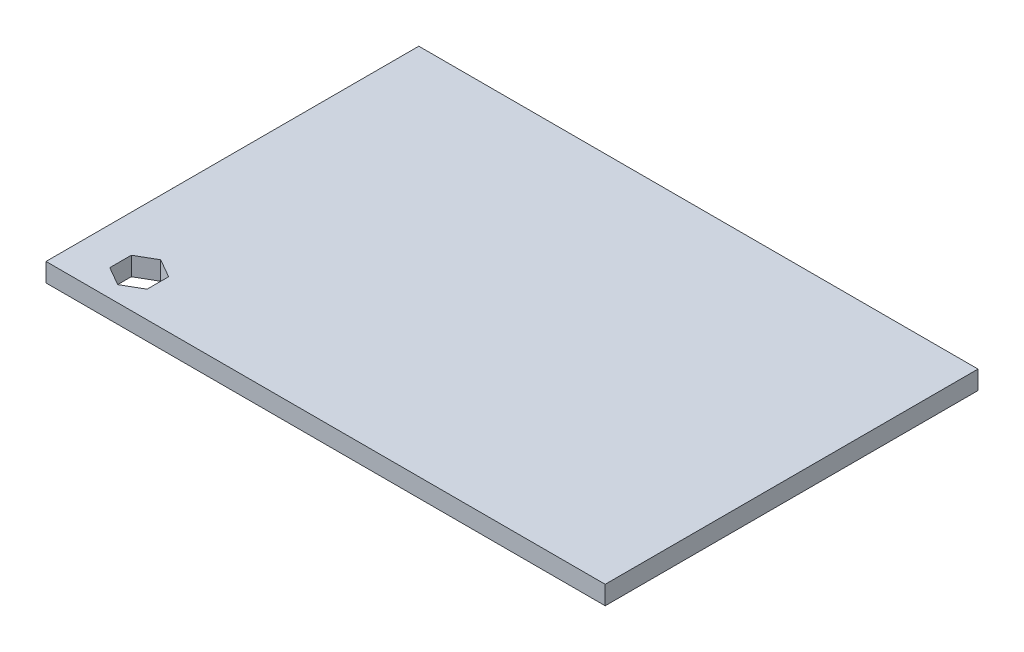
ISO-10303-21;
HEADER;
FILE_DESCRIPTION(('STEP AP214'),'2;1');
FILE_NAME('part.step','',(''),(''),'','','');
FILE_SCHEMA(('AUTOMOTIVE_DESIGN { 1 0 10303 214 1 1 1 1 }'));
ENDSEC;
DATA;
#1=APPLICATION_CONTEXT('core data for automotive mechanical design processes');
#2=APPLICATION_PROTOCOL_DEFINITION('international standard','automotive_design',2000,#1);
#3=PRODUCT_CONTEXT('',#1,'mechanical');
#4=PRODUCT('Part','Part','',(#3));
#5=PRODUCT_RELATED_PRODUCT_CATEGORY('part','',(#4));
#6=PRODUCT_DEFINITION_FORMATION('','',#4);
#7=PRODUCT_DEFINITION_CONTEXT('part definition',#1,'design');
#8=PRODUCT_DEFINITION('design','',#6,#7);
#9=PRODUCT_DEFINITION_SHAPE('','',#8);
#10=(LENGTH_UNIT() NAMED_UNIT(*) SI_UNIT(.MILLI.,.METRE.));
#11=(NAMED_UNIT(*) PLANE_ANGLE_UNIT() SI_UNIT($,.RADIAN.));
#12=(NAMED_UNIT(*) SI_UNIT($,.STERADIAN.) SOLID_ANGLE_UNIT());
#13=UNCERTAINTY_MEASURE_WITH_UNIT(LENGTH_MEASURE(1.E-05),#10,'distance_accuracy_value','');
#14=(GEOMETRIC_REPRESENTATION_CONTEXT(3) GLOBAL_UNCERTAINTY_ASSIGNED_CONTEXT((#13)) GLOBAL_UNIT_ASSIGNED_CONTEXT((#10,
#11,#12)) REPRESENTATION_CONTEXT('',''));
#15=CARTESIAN_POINT('',(0.,0.,0.));
#16=DIRECTION('',(0.,0.,1.));
#17=DIRECTION('',(1.,0.,0.));
#18=AXIS2_PLACEMENT_3D('',#15,#16,#17);
#19=CARTESIAN_POINT('',(0.,12.7,0.));
#20=DIRECTION('',(1.,0.,0.));
#21=DIRECTION('',(0.,0.,-1.));
#22=AXIS2_PLACEMENT_3D('',#19,#20,#21);
#23=PLANE('',#22);
#24=DIRECTION('',(0.,0.,1.));
#25=VECTOR('',#24,1.);
#26=CARTESIAN_POINT('',(0.,0.,0.));
#27=LINE('',#26,#25);
#28=CARTESIAN_POINT('',(0.,0.,-254.));
#29=VERTEX_POINT('',#28);
#30=CARTESIAN_POINT('',(0.,0.,0.));
#31=VERTEX_POINT('',#30);
#32=EDGE_CURVE('E155',#29,#31,#27,.T.);
#33=ORIENTED_EDGE('',*,*,#32,.T.);
#34=DIRECTION('',(0.,-1.,0.));
#35=VECTOR('',#34,1.);
#36=CARTESIAN_POINT('',(0.,12.7,0.));
#37=LINE('',#36,#35);
#38=CARTESIAN_POINT('',(0.,12.7,0.));
#39=VERTEX_POINT('',#38);
#40=EDGE_CURVE('E11',#39,#31,#37,.T.);
#41=ORIENTED_EDGE('',*,*,#40,.F.);
#42=DIRECTION('',(0.,0.,1.));
#43=VECTOR('',#42,1.);
#44=CARTESIAN_POINT('',(0.,12.7,0.));
#45=LINE('',#44,#43);
#46=CARTESIAN_POINT('',(0.,12.7,-254.));
#47=VERTEX_POINT('',#46);
#48=EDGE_CURVE('E163',#47,#39,#45,.T.);
#49=ORIENTED_EDGE('',*,*,#48,.F.);
#50=DIRECTION('',(0.,-1.,0.));
#51=VECTOR('',#50,1.);
#52=CARTESIAN_POINT('',(0.,12.7,-254.));
#53=LINE('',#52,#51);
#54=EDGE_CURVE('E173',#47,#29,#53,.T.);
#55=ORIENTED_EDGE('',*,*,#54,.T.);
#56=EDGE_LOOP('',(#33,#41,#49,#55));
#57=FACE_BOUND('',#56,.T.);
#58=ADVANCED_FACE('F34',(#57),#23,.F.);
#59=CARTESIAN_POINT('',(0.,12.7,0.));
#60=DIRECTION('',(0.,0.,-1.));
#61=DIRECTION('',(-1.,0.,0.));
#62=AXIS2_PLACEMENT_3D('',#59,#60,#61);
#63=PLANE('',#62);
#64=DIRECTION('',(1.,0.,0.));
#65=VECTOR('',#64,1.);
#66=CARTESIAN_POINT('',(0.,0.,0.));
#67=LINE('',#66,#65);
#68=CARTESIAN_POINT('',(381.,0.,0.));
#69=VERTEX_POINT('',#68);
#70=EDGE_CURVE('E176',#31,#69,#67,.T.);
#71=ORIENTED_EDGE('',*,*,#70,.T.);
#72=DIRECTION('',(0.,-1.,0.));
#73=VECTOR('',#72,1.);
#74=CARTESIAN_POINT('',(381.,12.7,0.));
#75=LINE('',#74,#73);
#76=CARTESIAN_POINT('',(381.,12.7,0.));
#77=VERTEX_POINT('',#76);
#78=EDGE_CURVE('E41',#77,#69,#75,.T.);
#79=ORIENTED_EDGE('',*,*,#78,.F.);
#80=DIRECTION('',(1.,0.,0.));
#81=VECTOR('',#80,1.);
#82=CARTESIAN_POINT('',(0.,12.7,0.));
#83=LINE('',#82,#81);
#84=EDGE_CURVE('E166',#39,#77,#83,.T.);
#85=ORIENTED_EDGE('',*,*,#84,.F.);
#86=ORIENTED_EDGE('',*,*,#40,.T.);
#87=EDGE_LOOP('',(#71,#79,#85,#86));
#88=FACE_BOUND('',#87,.T.);
#89=ADVANCED_FACE('F204',(#88),#63,.F.);
#90=CARTESIAN_POINT('',(381.,12.7,0.));
#91=DIRECTION('',(-1.,0.,0.));
#92=DIRECTION('',(0.,0.,1.));
#93=AXIS2_PLACEMENT_3D('',#90,#91,#92);
#94=PLANE('',#93);
#95=DIRECTION('',(0.,0.,-1.));
#96=VECTOR('',#95,1.);
#97=CARTESIAN_POINT('',(381.,0.,0.));
#98=LINE('',#97,#96);
#99=CARTESIAN_POINT('',(381.,0.,-254.));
#100=VERTEX_POINT('',#99);
#101=EDGE_CURVE('E178',#69,#100,#98,.T.);
#102=ORIENTED_EDGE('',*,*,#101,.T.);
#103=DIRECTION('',(0.,-1.,0.));
#104=VECTOR('',#103,1.);
#105=CARTESIAN_POINT('',(381.,12.7,-254.));
#106=LINE('',#105,#104);
#107=CARTESIAN_POINT('',(381.,12.7,-254.));
#108=VERTEX_POINT('',#107);
#109=EDGE_CURVE('E183',#108,#100,#106,.T.);
#110=ORIENTED_EDGE('',*,*,#109,.F.);
#111=DIRECTION('',(0.,0.,-1.));
#112=VECTOR('',#111,1.);
#113=CARTESIAN_POINT('',(381.,12.7,0.));
#114=LINE('',#113,#112);
#115=EDGE_CURVE('E169',#77,#108,#114,.T.);
#116=ORIENTED_EDGE('',*,*,#115,.F.);
#117=ORIENTED_EDGE('',*,*,#78,.T.);
#118=EDGE_LOOP('',(#102,#110,#116,#117));
#119=FACE_BOUND('',#118,.T.);
#120=ADVANCED_FACE('F190',(#119),#94,.F.);
#121=CARTESIAN_POINT('',(0.,12.7,-254.));
#122=DIRECTION('',(0.,0.,1.));
#123=DIRECTION('',(1.,0.,0.));
#124=AXIS2_PLACEMENT_3D('',#121,#122,#123);
#125=PLANE('',#124);
#126=DIRECTION('',(-1.,0.,0.));
#127=VECTOR('',#126,1.);
#128=CARTESIAN_POINT('',(0.,0.,-254.));
#129=LINE('',#128,#127);
#130=EDGE_CURVE('E167',#100,#29,#129,.T.);
#131=ORIENTED_EDGE('',*,*,#130,.T.);
#132=ORIENTED_EDGE('',*,*,#54,.F.);
#133=DIRECTION('',(-1.,0.,0.));
#134=VECTOR('',#133,1.);
#135=CARTESIAN_POINT('',(0.,12.7,-254.));
#136=LINE('',#135,#134);
#137=EDGE_CURVE('E171',#108,#47,#136,.T.);
#138=ORIENTED_EDGE('',*,*,#137,.F.);
#139=ORIENTED_EDGE('',*,*,#109,.T.);
#140=EDGE_LOOP('',(#131,#132,#138,#139));
#141=FACE_BOUND('',#140,.T.);
#142=ADVANCED_FACE('F197',(#141),#125,.F.);
#143=CARTESIAN_POINT('',(0.,12.7,0.));
#144=DIRECTION('',(0.,-1.,0.));
#145=DIRECTION('',(0.,0.,-1.));
#146=AXIS2_PLACEMENT_3D('',#143,#144,#145);
#147=PLANE('',#146);
#148=DIRECTION('',(-0.86602540378444,0.,-0.499999999999998));
#149=VECTOR('',#148,1.);
#150=CARTESIAN_POINT('',(50.7999999999999,12.7,-32.7323484187083));
#151=LINE('',#150,#149);
#152=CARTESIAN_POINT('',(50.7999999999999,12.7,-32.7323484187083));
#153=VERTEX_POINT('',#152);
#154=CARTESIAN_POINT('',(38.1,12.7,-40.0646968374165));
#155=VERTEX_POINT('',#154);
#156=EDGE_CURVE('E143',#153,#155,#151,.T.);
#157=ORIENTED_EDGE('',*,*,#156,.F.);
#158=DIRECTION('',(0.,0.,-1.));
#159=VECTOR('',#158,1.);
#160=CARTESIAN_POINT('',(50.8,12.7,-18.0676515812919));
#161=LINE('',#160,#159);
#162=CARTESIAN_POINT('',(50.8,12.7,-18.0676515812919));
#163=VERTEX_POINT('',#162);
#164=EDGE_CURVE('E48',#163,#153,#161,.T.);
#165=ORIENTED_EDGE('',*,*,#164,.F.);
#166=DIRECTION('',(0.866025403784435,0.,-0.500000000000007));
#167=VECTOR('',#166,1.);
#168=CARTESIAN_POINT('',(38.1000000000001,12.7,-10.7353031625836));
#169=LINE('',#168,#167);
#170=CARTESIAN_POINT('',(38.1000000000001,12.7,-10.7353031625836));
#171=VERTEX_POINT('',#170);
#172=EDGE_CURVE('E129',#171,#163,#169,.T.);
#173=ORIENTED_EDGE('',*,*,#172,.F.);
#174=DIRECTION('',(0.866025403784441,0.,0.499999999999995));
#175=VECTOR('',#174,1.);
#176=CARTESIAN_POINT('',(25.4000000000001,12.7,-18.0676515812917));
#177=LINE('',#176,#175);
#178=CARTESIAN_POINT('',(25.4000000000001,12.7,-18.0676515812917));
#179=VERTEX_POINT('',#178);
#180=EDGE_CURVE('E132',#179,#171,#177,.T.);
#181=ORIENTED_EDGE('',*,*,#180,.F.);
#182=DIRECTION('',(0.,0.,1.));
#183=VECTOR('',#182,1.);
#184=CARTESIAN_POINT('',(25.4,12.7,-32.7323484187082));
#185=LINE('',#184,#183);
#186=CARTESIAN_POINT('',(25.4,12.7,-32.7323484187082));
#187=VERTEX_POINT('',#186);
#188=EDGE_CURVE('E148',#187,#179,#185,.T.);
#189=ORIENTED_EDGE('',*,*,#188,.F.);
#190=DIRECTION('',(-0.866025403784438,0.,0.5));
#191=VECTOR('',#190,1.);
#192=CARTESIAN_POINT('',(38.1,12.7,-40.0646968374165));
#193=LINE('',#192,#191);
#194=EDGE_CURVE('E145',#155,#187,#193,.T.);
#195=ORIENTED_EDGE('',*,*,#194,.F.);
#196=EDGE_LOOP('',(#157,#165,#173,#181,#189,#195));
#197=FACE_BOUND('',#196,.T.);
#198=ORIENTED_EDGE('',*,*,#48,.T.);
#199=ORIENTED_EDGE('',*,*,#84,.T.);
#200=ORIENTED_EDGE('',*,*,#115,.T.);
#201=ORIENTED_EDGE('',*,*,#137,.T.);
#202=EDGE_LOOP('',(#198,#199,#200,#201));
#203=FACE_BOUND('',#202,.T.);
#204=ADVANCED_FACE('F203',(#197,#203),#147,.F.);
#205=CARTESIAN_POINT('',(0.,0.,0.));
#206=DIRECTION('',(0.,-1.,0.));
#207=DIRECTION('',(0.,0.,-1.));
#208=AXIS2_PLACEMENT_3D('',#205,#206,#207);
#209=PLANE('',#208);
#210=DIRECTION('',(0.,0.,-1.));
#211=VECTOR('',#210,1.);
#212=CARTESIAN_POINT('',(50.8,0.,-18.0676515812919));
#213=LINE('',#212,#211);
#214=CARTESIAN_POINT('',(50.8,0.,-18.0676515812919));
#215=VERTEX_POINT('',#214);
#216=CARTESIAN_POINT('',(50.7999999999999,0.,-32.7323484187083));
#217=VERTEX_POINT('',#216);
#218=EDGE_CURVE('E112',#215,#217,#213,.T.);
#219=ORIENTED_EDGE('',*,*,#218,.T.);
#220=DIRECTION('',(-0.86602540378444,0.,-0.499999999999998));
#221=VECTOR('',#220,1.);
#222=CARTESIAN_POINT('',(50.7999999999999,0.,-32.7323484187083));
#223=LINE('',#222,#221);
#224=CARTESIAN_POINT('',(38.1,0.,-40.0646968374165));
#225=VERTEX_POINT('',#224);
#226=EDGE_CURVE('E121',#217,#225,#223,.T.);
#227=ORIENTED_EDGE('',*,*,#226,.T.);
#228=DIRECTION('',(-0.866025403784438,0.,0.5));
#229=VECTOR('',#228,1.);
#230=CARTESIAN_POINT('',(38.1,0.,-40.0646968374165));
#231=LINE('',#230,#229);
#232=CARTESIAN_POINT('',(25.4,0.,-32.7323484187082));
#233=VERTEX_POINT('',#232);
#234=EDGE_CURVE('E56',#225,#233,#231,.T.);
#235=ORIENTED_EDGE('',*,*,#234,.T.);
#236=DIRECTION('',(0.,0.,1.));
#237=VECTOR('',#236,1.);
#238=CARTESIAN_POINT('',(25.4,0.,-32.7323484187082));
#239=LINE('',#238,#237);
#240=CARTESIAN_POINT('',(25.4000000000001,0.,-18.0676515812917));
#241=VERTEX_POINT('',#240);
#242=EDGE_CURVE('E136',#233,#241,#239,.T.);
#243=ORIENTED_EDGE('',*,*,#242,.T.);
#244=DIRECTION('',(0.866025403784441,0.,0.499999999999995));
#245=VECTOR('',#244,1.);
#246=CARTESIAN_POINT('',(25.4000000000001,0.,-18.0676515812917));
#247=LINE('',#246,#245);
#248=CARTESIAN_POINT('',(38.1000000000001,0.,-10.7353031625836));
#249=VERTEX_POINT('',#248);
#250=EDGE_CURVE('E139',#241,#249,#247,.T.);
#251=ORIENTED_EDGE('',*,*,#250,.T.);
#252=DIRECTION('',(0.866025403784435,0.,-0.500000000000007));
#253=VECTOR('',#252,1.);
#254=CARTESIAN_POINT('',(38.1000000000001,0.,-10.7353031625836));
#255=LINE('',#254,#253);
#256=EDGE_CURVE('E118',#249,#215,#255,.T.);
#257=ORIENTED_EDGE('',*,*,#256,.T.);
#258=EDGE_LOOP('',(#219,#227,#235,#243,#251,#257));
#259=FACE_BOUND('',#258,.T.);
#260=ORIENTED_EDGE('',*,*,#32,.F.);
#261=ORIENTED_EDGE('',*,*,#130,.F.);
#262=ORIENTED_EDGE('',*,*,#101,.F.);
#263=ORIENTED_EDGE('',*,*,#70,.F.);
#264=EDGE_LOOP('',(#260,#261,#262,#263));
#265=FACE_BOUND('',#264,.T.);
#266=ADVANCED_FACE('F125',(#259,#265),#209,.T.);
#267=CARTESIAN_POINT('',(50.8,0.,-18.0676515812919));
#268=DIRECTION('',(1.,0.,0.));
#269=DIRECTION('',(0.,0.,-1.));
#270=AXIS2_PLACEMENT_3D('',#267,#268,#269);
#271=PLANE('',#270);
#272=ORIENTED_EDGE('',*,*,#164,.T.);
#273=DIRECTION('',(0.,1.,0.));
#274=VECTOR('',#273,1.);
#275=CARTESIAN_POINT('',(50.7999999999999,0.,-32.7323484187083));
#276=LINE('',#275,#274);
#277=EDGE_CURVE('E108',#217,#153,#276,.T.);
#278=ORIENTED_EDGE('',*,*,#277,.F.);
#279=ORIENTED_EDGE('',*,*,#218,.F.);
#280=DIRECTION('',(0.,1.,0.));
#281=VECTOR('',#280,1.);
#282=CARTESIAN_POINT('',(50.8,0.,-18.0676515812919));
#283=LINE('',#282,#281);
#284=EDGE_CURVE('E153',#215,#163,#283,.T.);
#285=ORIENTED_EDGE('',*,*,#284,.T.);
#286=EDGE_LOOP('',(#272,#278,#279,#285));
#287=FACE_BOUND('',#286,.T.);
#288=ADVANCED_FACE('F110',(#287),#271,.F.);
#289=CARTESIAN_POINT('',(38.1000000000001,0.,-10.7353031625836));
#290=DIRECTION('',(0.500000000000007,0.,0.866025403784435));
#291=DIRECTION('',(0.866025403784435,0.,-0.500000000000007));
#292=AXIS2_PLACEMENT_3D('',#289,#290,#291);
#293=PLANE('',#292);
#294=ORIENTED_EDGE('',*,*,#172,.T.);
#295=ORIENTED_EDGE('',*,*,#284,.F.);
#296=ORIENTED_EDGE('',*,*,#256,.F.);
#297=DIRECTION('',(0.,1.,0.));
#298=VECTOR('',#297,1.);
#299=CARTESIAN_POINT('',(38.1000000000001,0.,-10.7353031625836));
#300=LINE('',#299,#298);
#301=EDGE_CURVE('E156',#249,#171,#300,.T.);
#302=ORIENTED_EDGE('',*,*,#301,.T.);
#303=EDGE_LOOP('',(#294,#295,#296,#302));
#304=FACE_BOUND('',#303,.T.);
#305=ADVANCED_FACE('F221',(#304),#293,.F.);
#306=CARTESIAN_POINT('',(25.4000000000001,0.,-18.0676515812917));
#307=DIRECTION('',(-0.499999999999995,0.,0.866025403784441));
#308=DIRECTION('',(0.866025403784441,0.,0.499999999999995));
#309=AXIS2_PLACEMENT_3D('',#306,#307,#308);
#310=PLANE('',#309);
#311=ORIENTED_EDGE('',*,*,#180,.T.);
#312=ORIENTED_EDGE('',*,*,#301,.F.);
#313=ORIENTED_EDGE('',*,*,#250,.F.);
#314=DIRECTION('',(0.,1.,0.));
#315=VECTOR('',#314,1.);
#316=CARTESIAN_POINT('',(25.4000000000001,0.,-18.0676515812917));
#317=LINE('',#316,#315);
#318=EDGE_CURVE('E158',#241,#179,#317,.T.);
#319=ORIENTED_EDGE('',*,*,#318,.T.);
#320=EDGE_LOOP('',(#311,#312,#313,#319));
#321=FACE_BOUND('',#320,.T.);
#322=ADVANCED_FACE('F230',(#321),#310,.F.);
#323=CARTESIAN_POINT('',(25.4,0.,-32.7323484187082));
#324=DIRECTION('',(-1.,0.,0.));
#325=DIRECTION('',(0.,0.,1.));
#326=AXIS2_PLACEMENT_3D('',#323,#324,#325);
#327=PLANE('',#326);
#328=ORIENTED_EDGE('',*,*,#188,.T.);
#329=ORIENTED_EDGE('',*,*,#318,.F.);
#330=ORIENTED_EDGE('',*,*,#242,.F.);
#331=DIRECTION('',(0.,1.,0.));
#332=VECTOR('',#331,1.);
#333=CARTESIAN_POINT('',(25.4,0.,-32.7323484187082));
#334=LINE('',#333,#332);
#335=EDGE_CURVE('E160',#233,#187,#334,.T.);
#336=ORIENTED_EDGE('',*,*,#335,.T.);
#337=EDGE_LOOP('',(#328,#329,#330,#336));
#338=FACE_BOUND('',#337,.T.);
#339=ADVANCED_FACE('F227',(#338),#327,.F.);
#340=CARTESIAN_POINT('',(38.1,0.,-40.0646968374165));
#341=DIRECTION('',(-0.5,0.,-0.866025403784438));
#342=DIRECTION('',(-0.866025403784438,0.,0.5));
#343=AXIS2_PLACEMENT_3D('',#340,#341,#342);
#344=PLANE('',#343);
#345=ORIENTED_EDGE('',*,*,#194,.T.);
#346=ORIENTED_EDGE('',*,*,#335,.F.);
#347=ORIENTED_EDGE('',*,*,#234,.F.);
#348=DIRECTION('',(0.,1.,0.));
#349=VECTOR('',#348,1.);
#350=CARTESIAN_POINT('',(38.1,0.,-40.0646968374165));
#351=LINE('',#350,#349);
#352=EDGE_CURVE('E117',#225,#155,#351,.T.);
#353=ORIENTED_EDGE('',*,*,#352,.T.);
#354=EDGE_LOOP('',(#345,#346,#347,#353));
#355=FACE_BOUND('',#354,.T.);
#356=ADVANCED_FACE('F224',(#355),#344,.F.);
#357=CARTESIAN_POINT('',(50.7999999999999,0.,-32.7323484187083));
#358=DIRECTION('',(0.499999999999998,0.,-0.86602540378444));
#359=DIRECTION('',(-0.86602540378444,0.,-0.499999999999998));
#360=AXIS2_PLACEMENT_3D('',#357,#358,#359);
#361=PLANE('',#360);
#362=ORIENTED_EDGE('',*,*,#156,.T.);
#363=ORIENTED_EDGE('',*,*,#352,.F.);
#364=ORIENTED_EDGE('',*,*,#226,.F.);
#365=ORIENTED_EDGE('',*,*,#277,.T.);
#366=EDGE_LOOP('',(#362,#363,#364,#365));
#367=FACE_BOUND('',#366,.T.);
#368=ADVANCED_FACE('F122',(#367),#361,.F.);
#369=CLOSED_SHELL('',(#58,#89,#120,#142,#204,#266,#288,#305,#322,#339,#356,#368));
#370=MANIFOLD_SOLID_BREP('B2',#369);
#371=ADVANCED_BREP_SHAPE_REPRESENTATION('',(#18,#370),#14);
#372=SHAPE_DEFINITION_REPRESENTATION(#9,#371);
ENDSEC;
END-ISO-10303-21;
